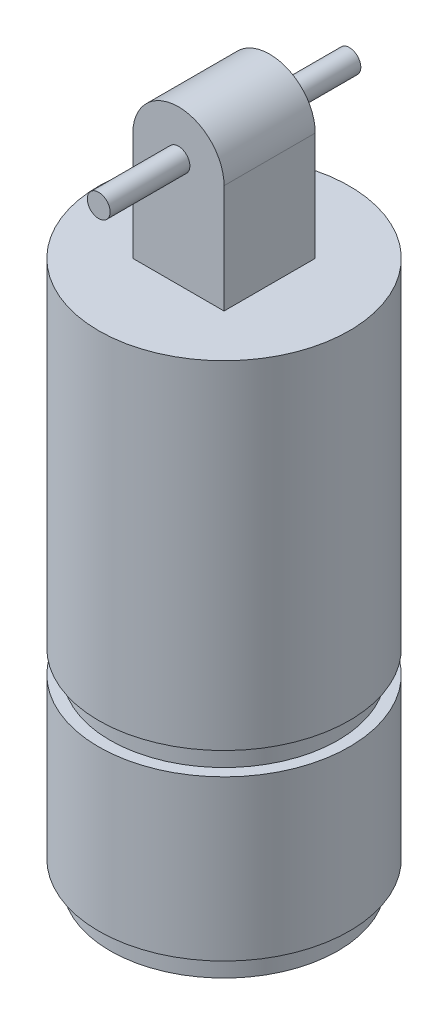
ISO-10303-21;
HEADER;
FILE_DESCRIPTION(('STEP AP214'),'2;1');
FILE_NAME('part.step','',(''),(''),'','','');
FILE_SCHEMA(('AUTOMOTIVE_DESIGN { 1 0 10303 214 1 1 1 1 }'));
ENDSEC;
DATA;
#1=APPLICATION_CONTEXT('core data for automotive mechanical design processes');
#2=APPLICATION_PROTOCOL_DEFINITION('international standard','automotive_design',2000,#1);
#3=PRODUCT_CONTEXT('',#1,'mechanical');
#4=PRODUCT('Part','Part','',(#3));
#5=PRODUCT_RELATED_PRODUCT_CATEGORY('part','',(#4));
#6=PRODUCT_DEFINITION_FORMATION('','',#4);
#7=PRODUCT_DEFINITION_CONTEXT('part definition',#1,'design');
#8=PRODUCT_DEFINITION('design','',#6,#7);
#9=PRODUCT_DEFINITION_SHAPE('','',#8);
#10=(LENGTH_UNIT() NAMED_UNIT(*) SI_UNIT(.MILLI.,.METRE.));
#11=(NAMED_UNIT(*) PLANE_ANGLE_UNIT() SI_UNIT($,.RADIAN.));
#12=(NAMED_UNIT(*) SI_UNIT($,.STERADIAN.) SOLID_ANGLE_UNIT());
#13=UNCERTAINTY_MEASURE_WITH_UNIT(LENGTH_MEASURE(1.E-05),#10,'distance_accuracy_value','');
#14=(GEOMETRIC_REPRESENTATION_CONTEXT(3) GLOBAL_UNCERTAINTY_ASSIGNED_CONTEXT((#13)) GLOBAL_UNIT_ASSIGNED_CONTEXT((#10,
#11,#12)) REPRESENTATION_CONTEXT('',''));
#15=CARTESIAN_POINT('',(0.,0.,0.));
#16=DIRECTION('',(0.,0.,1.));
#17=DIRECTION('',(1.,0.,0.));
#18=AXIS2_PLACEMENT_3D('',#15,#16,#17);
#19=CARTESIAN_POINT('',(0.,23.8125,0.));
#20=DIRECTION('',(0.,1.,0.));
#21=DIRECTION('',(0.,0.,1.));
#22=AXIS2_PLACEMENT_3D('',#19,#20,#21);
#23=PLANE('',#22);
#24=CARTESIAN_POINT('',(0.,23.8125,0.));
#25=DIRECTION('',(0.,1.,0.));
#26=DIRECTION('',(0.,0.,1.));
#27=AXIS2_PLACEMENT_3D('',#24,#25,#26);
#28=CIRCLE('',#27,5.5);
#29=CARTESIAN_POINT('',(0.,23.8125,5.5));
#30=VERTEX_POINT('',#29);
#31=EDGE_CURVE('E116',#30,#30,#28,.T.);
#32=ORIENTED_EDGE('',*,*,#31,.T.);
#33=EDGE_LOOP('',(#32));
#34=FACE_BOUND('',#33,.T.);
#35=DIRECTION('',(0.,0.,-1.));
#36=VECTOR('',#35,1.);
#37=CARTESIAN_POINT('',(-2.,23.8125,2.));
#38=LINE('',#37,#36);
#39=CARTESIAN_POINT('',(-2.,23.8125,2.));
#40=VERTEX_POINT('',#39);
#41=CARTESIAN_POINT('',(-2.,23.8125,-2.));
#42=VERTEX_POINT('',#41);
#43=EDGE_CURVE('E100',#40,#42,#38,.T.);
#44=ORIENTED_EDGE('',*,*,#43,.T.);
#45=DIRECTION('',(1.,0.,0.));
#46=VECTOR('',#45,1.);
#47=CARTESIAN_POINT('',(-2.,23.8125,-2.));
#48=LINE('',#47,#46);
#49=CARTESIAN_POINT('',(2.,23.8125,-2.));
#50=VERTEX_POINT('',#49);
#51=EDGE_CURVE('E99',#42,#50,#48,.T.);
#52=ORIENTED_EDGE('',*,*,#51,.T.);
#53=DIRECTION('',(0.,0.,-1.));
#54=VECTOR('',#53,1.);
#55=CARTESIAN_POINT('',(2.,23.8125,2.));
#56=LINE('',#55,#54);
#57=CARTESIAN_POINT('',(2.,23.8125,2.));
#58=VERTEX_POINT('',#57);
#59=EDGE_CURVE('E94',#58,#50,#56,.T.);
#60=ORIENTED_EDGE('',*,*,#59,.F.);
#61=DIRECTION('',(1.,0.,0.));
#62=VECTOR('',#61,1.);
#63=CARTESIAN_POINT('',(-2.,23.8125,2.));
#64=LINE('',#63,#62);
#65=EDGE_CURVE('E83',#40,#58,#64,.T.);
#66=ORIENTED_EDGE('',*,*,#65,.F.);
#67=EDGE_LOOP('',(#44,#52,#60,#66));
#68=FACE_BOUND('',#67,.T.);
#69=ADVANCED_FACE('F36',(#34,#68),#23,.T.);
#70=CARTESIAN_POINT('',(0.,9.,0.));
#71=DIRECTION('',(0.,-1.,0.));
#72=DIRECTION('',(0.,0.,-1.));
#73=AXIS2_PLACEMENT_3D('',#70,#71,#72);
#74=CYLINDRICAL_SURFACE('',#73,5.);
#75=CARTESIAN_POINT('',(0.,8.,0.));
#76=DIRECTION('',(0.,1.,0.));
#77=DIRECTION('',(0.,0.,1.));
#78=AXIS2_PLACEMENT_3D('',#75,#76,#77);
#79=CIRCLE('',#78,5.);
#80=CARTESIAN_POINT('',(0.,8.,5.));
#81=VERTEX_POINT('',#80);
#82=EDGE_CURVE('E123',#81,#81,#79,.T.);
#83=ORIENTED_EDGE('',*,*,#82,.T.);
#84=EDGE_LOOP('',(#83));
#85=FACE_BOUND('',#84,.T.);
#86=CARTESIAN_POINT('',(0.,9.,0.));
#87=DIRECTION('',(0.,1.,0.));
#88=DIRECTION('',(0.,0.,1.));
#89=AXIS2_PLACEMENT_3D('',#86,#87,#88);
#90=CIRCLE('',#89,5.);
#91=CARTESIAN_POINT('',(0.,9.,5.));
#92=VERTEX_POINT('',#91);
#93=EDGE_CURVE('E126',#92,#92,#90,.T.);
#94=ORIENTED_EDGE('',*,*,#93,.F.);
#95=EDGE_LOOP('',(#94));
#96=FACE_BOUND('',#95,.T.);
#97=ADVANCED_FACE('F38',(#85,#96),#74,.T.);
#98=CARTESIAN_POINT('',(0.,8.,0.));
#99=DIRECTION('',(0.,-1.,0.));
#100=DIRECTION('',(0.,0.,-1.));
#101=AXIS2_PLACEMENT_3D('',#98,#99,#100);
#102=CYLINDRICAL_SURFACE('',#101,5.5);
#103=CARTESIAN_POINT('',(0.,8.,0.));
#104=DIRECTION('',(0.,1.,0.));
#105=DIRECTION('',(0.,0.,1.));
#106=AXIS2_PLACEMENT_3D('',#103,#104,#105);
#107=CIRCLE('',#106,5.5);
#108=CARTESIAN_POINT('',(0.,8.,5.5));
#109=VERTEX_POINT('',#108);
#110=EDGE_CURVE('E120',#109,#109,#107,.T.);
#111=ORIENTED_EDGE('',*,*,#110,.F.);
#112=EDGE_LOOP('',(#111));
#113=FACE_BOUND('',#112,.T.);
#114=CARTESIAN_POINT('',(0.,1.,0.));
#115=DIRECTION('',(0.,1.,0.));
#116=DIRECTION('',(0.,0.,1.));
#117=AXIS2_PLACEMENT_3D('',#114,#115,#116);
#118=CIRCLE('',#117,5.5);
#119=CARTESIAN_POINT('',(0.,1.,5.5));
#120=VERTEX_POINT('',#119);
#121=EDGE_CURVE('E119',#120,#120,#118,.T.);
#122=ORIENTED_EDGE('',*,*,#121,.T.);
#123=EDGE_LOOP('',(#122));
#124=FACE_BOUND('',#123,.T.);
#125=ADVANCED_FACE('F142',(#113,#124),#102,.T.);
#126=CARTESIAN_POINT('',(0.,8.,0.));
#127=DIRECTION('',(0.,1.,0.));
#128=DIRECTION('',(0.,0.,1.));
#129=AXIS2_PLACEMENT_3D('',#126,#127,#128);
#130=PLANE('',#129);
#131=ORIENTED_EDGE('',*,*,#82,.F.);
#132=EDGE_LOOP('',(#131));
#133=FACE_BOUND('',#132,.T.);
#134=ORIENTED_EDGE('',*,*,#110,.T.);
#135=EDGE_LOOP('',(#134));
#136=FACE_BOUND('',#135,.T.);
#137=ADVANCED_FACE('F138',(#133,#136),#130,.T.);
#138=CARTESIAN_POINT('',(0.,1.,0.));
#139=DIRECTION('',(0.,1.,0.));
#140=DIRECTION('',(0.,0.,1.));
#141=AXIS2_PLACEMENT_3D('',#138,#139,#140);
#142=PLANE('',#141);
#143=CARTESIAN_POINT('',(0.,0.999999999999999,0.));
#144=DIRECTION('',(0.,1.,0.));
#145=DIRECTION('',(0.,0.,1.));
#146=AXIS2_PLACEMENT_3D('',#143,#144,#145);
#147=CIRCLE('',#146,5.);
#148=CARTESIAN_POINT('',(0.,0.999999999999999,5.));
#149=VERTEX_POINT('',#148);
#150=EDGE_CURVE('E44',#149,#149,#147,.T.);
#151=ORIENTED_EDGE('',*,*,#150,.T.);
#152=EDGE_LOOP('',(#151));
#153=FACE_BOUND('',#152,.T.);
#154=ORIENTED_EDGE('',*,*,#121,.F.);
#155=EDGE_LOOP('',(#154));
#156=FACE_BOUND('',#155,.T.);
#157=ADVANCED_FACE('F141',(#153,#156),#142,.F.);
#158=CARTESIAN_POINT('',(0.,0.,0.));
#159=DIRECTION('',(0.,1.,0.));
#160=DIRECTION('',(0.,0.,1.));
#161=AXIS2_PLACEMENT_3D('',#158,#159,#160);
#162=PLANE('',#161);
#163=CARTESIAN_POINT('',(0.,0.,0.));
#164=DIRECTION('',(0.,-1.,0.));
#165=DIRECTION('',(0.,0.,-1.));
#166=AXIS2_PLACEMENT_3D('',#163,#164,#165);
#167=CIRCLE('',#166,4.);
#168=CARTESIAN_POINT('',(0.,0.,-4.));
#169=VERTEX_POINT('',#168);
#170=EDGE_CURVE('E102',#169,#169,#167,.T.);
#171=ORIENTED_EDGE('',*,*,#170,.F.);
#172=EDGE_LOOP('',(#171));
#173=FACE_BOUND('',#172,.T.);
#174=CARTESIAN_POINT('',(0.,0.,0.));
#175=DIRECTION('',(0.,1.,0.));
#176=DIRECTION('',(0.,0.,1.));
#177=AXIS2_PLACEMENT_3D('',#174,#175,#176);
#178=CIRCLE('',#177,5.);
#179=CARTESIAN_POINT('',(0.,0.,5.));
#180=VERTEX_POINT('',#179);
#181=EDGE_CURVE('E129',#180,#180,#178,.T.);
#182=ORIENTED_EDGE('',*,*,#181,.F.);
#183=EDGE_LOOP('',(#182));
#184=FACE_BOUND('',#183,.T.);
#185=ADVANCED_FACE('F152',(#173,#184),#162,.F.);
#186=ORIENTED_EDGE('',*,*,#181,.T.);
#187=EDGE_LOOP('',(#186));
#188=FACE_BOUND('',#187,.T.);
#189=ORIENTED_EDGE('',*,*,#150,.F.);
#190=EDGE_LOOP('',(#189));
#191=FACE_BOUND('',#190,.T.);
#192=ADVANCED_FACE('F158',(#188,#191),#74,.T.);
#193=CARTESIAN_POINT('',(0.,39.368849186104,0.));
#194=DIRECTION('',(0.,-1.,0.));
#195=DIRECTION('',(0.,0.,-1.));
#196=AXIS2_PLACEMENT_3D('',#193,#194,#195);
#197=CYLINDRICAL_SURFACE('',#196,5.5);
#198=CARTESIAN_POINT('',(0.,9.,0.));
#199=DIRECTION('',(0.,1.,0.));
#200=DIRECTION('',(0.,0.,1.));
#201=AXIS2_PLACEMENT_3D('',#198,#199,#200);
#202=CIRCLE('',#201,5.5);
#203=CARTESIAN_POINT('',(0.,9.,5.5));
#204=VERTEX_POINT('',#203);
#205=EDGE_CURVE('E111',#204,#204,#202,.T.);
#206=ORIENTED_EDGE('',*,*,#205,.T.);
#207=EDGE_LOOP('',(#206));
#208=FACE_BOUND('',#207,.T.);
#209=ORIENTED_EDGE('',*,*,#31,.F.);
#210=EDGE_LOOP('',(#209));
#211=FACE_BOUND('',#210,.T.);
#212=ADVANCED_FACE('F167',(#208,#211),#197,.T.);
#213=CARTESIAN_POINT('',(0.,9.,0.));
#214=DIRECTION('',(0.,1.,0.));
#215=DIRECTION('',(0.,0.,1.));
#216=AXIS2_PLACEMENT_3D('',#213,#214,#215);
#217=PLANE('',#216);
#218=ORIENTED_EDGE('',*,*,#93,.T.);
#219=EDGE_LOOP('',(#218));
#220=FACE_BOUND('',#219,.T.);
#221=ORIENTED_EDGE('',*,*,#205,.F.);
#222=EDGE_LOOP('',(#221));
#223=FACE_BOUND('',#222,.T.);
#224=ADVANCED_FACE('F170',(#220,#223),#217,.F.);
#225=CARTESIAN_POINT('',(0.,7.,0.));
#226=DIRECTION('',(0.,-1.,0.));
#227=DIRECTION('',(0.,0.,-1.));
#228=AXIS2_PLACEMENT_3D('',#225,#226,#227);
#229=CYLINDRICAL_SURFACE('',#228,4.);
#230=CARTESIAN_POINT('',(0.,7.,0.));
#231=DIRECTION('',(0.,-1.,0.));
#232=DIRECTION('',(0.,0.,-1.));
#233=AXIS2_PLACEMENT_3D('',#230,#231,#232);
#234=CIRCLE('',#233,4.);
#235=CARTESIAN_POINT('',(0.,7.,-4.));
#236=VERTEX_POINT('',#235);
#237=EDGE_CURVE('E108',#236,#236,#234,.T.);
#238=ORIENTED_EDGE('',*,*,#237,.F.);
#239=EDGE_LOOP('',(#238));
#240=FACE_BOUND('',#239,.T.);
#241=ORIENTED_EDGE('',*,*,#170,.T.);
#242=EDGE_LOOP('',(#241));
#243=FACE_BOUND('',#242,.T.);
#244=ADVANCED_FACE('F174',(#240,#243),#229,.F.);
#245=CARTESIAN_POINT('',(0.,7.,0.));
#246=DIRECTION('',(0.,-1.,0.));
#247=DIRECTION('',(0.,0.,-1.));
#248=AXIS2_PLACEMENT_3D('',#245,#246,#247);
#249=PLANE('',#248);
#250=ORIENTED_EDGE('',*,*,#237,.T.);
#251=EDGE_LOOP('',(#250));
#252=FACE_BOUND('',#251,.T.);
#253=ADVANCED_FACE('F178',(#252),#249,.T.);
#254=CARTESIAN_POINT('',(-2.,28.575,2.));
#255=DIRECTION('',(1.,0.,0.));
#256=DIRECTION('',(0.,1.,0.));
#257=AXIS2_PLACEMENT_3D('',#254,#255,#256);
#258=PLANE('',#257);
#259=DIRECTION('',(0.,-1.,0.));
#260=VECTOR('',#259,1.);
#261=CARTESIAN_POINT('',(-2.,28.575,-2.));
#262=LINE('',#261,#260);
#263=CARTESIAN_POINT('',(-2.,28.575,-2.));
#264=VERTEX_POINT('',#263);
#265=EDGE_CURVE('E51',#264,#42,#262,.T.);
#266=ORIENTED_EDGE('',*,*,#265,.T.);
#267=ORIENTED_EDGE('',*,*,#43,.F.);
#268=DIRECTION('',(0.,-1.,0.));
#269=VECTOR('',#268,1.);
#270=CARTESIAN_POINT('',(-2.,28.575,2.));
#271=LINE('',#270,#269);
#272=CARTESIAN_POINT('',(-2.,28.575,2.));
#273=VERTEX_POINT('',#272);
#274=EDGE_CURVE('E81',#273,#40,#271,.T.);
#275=ORIENTED_EDGE('',*,*,#274,.F.);
#276=DIRECTION('',(0.,0.,-1.));
#277=VECTOR('',#276,1.);
#278=CARTESIAN_POINT('',(-2.,28.575,2.));
#279=LINE('',#278,#277);
#280=EDGE_CURVE('E104',#273,#264,#279,.T.);
#281=ORIENTED_EDGE('',*,*,#280,.T.);
#282=EDGE_LOOP('',(#266,#267,#275,#281));
#283=FACE_BOUND('',#282,.T.);
#284=ADVANCED_FACE('F182',(#283),#258,.F.);
#285=CARTESIAN_POINT('',(2.,23.8125,2.));
#286=DIRECTION('',(-1.,0.,0.));
#287=DIRECTION('',(0.,-1.,0.));
#288=AXIS2_PLACEMENT_3D('',#285,#286,#287);
#289=PLANE('',#288);
#290=DIRECTION('',(0.,1.,0.));
#291=VECTOR('',#290,1.);
#292=CARTESIAN_POINT('',(2.,23.8125,-2.));
#293=LINE('',#292,#291);
#294=CARTESIAN_POINT('',(2.,28.575,-2.));
#295=VERTEX_POINT('',#294);
#296=EDGE_CURVE('E229',#50,#295,#293,.T.);
#297=ORIENTED_EDGE('',*,*,#296,.T.);
#298=DIRECTION('',(0.,0.,-1.));
#299=VECTOR('',#298,1.);
#300=CARTESIAN_POINT('',(2.,28.575,2.));
#301=LINE('',#300,#299);
#302=CARTESIAN_POINT('',(2.,28.575,2.));
#303=VERTEX_POINT('',#302);
#304=EDGE_CURVE('E96',#303,#295,#301,.T.);
#305=ORIENTED_EDGE('',*,*,#304,.F.);
#306=DIRECTION('',(0.,1.,0.));
#307=VECTOR('',#306,1.);
#308=CARTESIAN_POINT('',(2.,23.8125,2.));
#309=LINE('',#308,#307);
#310=EDGE_CURVE('E86',#58,#303,#309,.T.);
#311=ORIENTED_EDGE('',*,*,#310,.F.);
#312=ORIENTED_EDGE('',*,*,#59,.T.);
#313=EDGE_LOOP('',(#297,#305,#311,#312));
#314=FACE_BOUND('',#313,.T.);
#315=ADVANCED_FACE('F93',(#314),#289,.F.);
#316=CARTESIAN_POINT('',(0.,28.575,2.));
#317=DIRECTION('',(0.,0.,-1.));
#318=DIRECTION('',(-1.,0.,0.));
#319=AXIS2_PLACEMENT_3D('',#316,#317,#318);
#320=CYLINDRICAL_SURFACE('',#319,2.);
#321=CARTESIAN_POINT('',(0.,28.575,-2.));
#322=DIRECTION('',(0.,0.,1.));
#323=DIRECTION('',(1.,0.,0.));
#324=AXIS2_PLACEMENT_3D('',#321,#322,#323);
#325=CIRCLE('',#324,2.);
#326=EDGE_CURVE('E77',#295,#264,#325,.T.);
#327=ORIENTED_EDGE('',*,*,#326,.T.);
#328=ORIENTED_EDGE('',*,*,#280,.F.);
#329=CARTESIAN_POINT('',(0.,28.575,2.));
#330=DIRECTION('',(0.,0.,1.));
#331=DIRECTION('',(1.,0.,0.));
#332=AXIS2_PLACEMENT_3D('',#329,#330,#331);
#333=CIRCLE('',#332,2.);
#334=EDGE_CURVE('E60',#303,#273,#333,.T.);
#335=ORIENTED_EDGE('',*,*,#334,.F.);
#336=ORIENTED_EDGE('',*,*,#304,.T.);
#337=EDGE_LOOP('',(#327,#328,#335,#336));
#338=FACE_BOUND('',#337,.T.);
#339=ADVANCED_FACE('F188',(#338),#320,.T.);
#340=CARTESIAN_POINT('',(0.,28.575,2.));
#341=DIRECTION('',(0.,0.,1.));
#342=DIRECTION('',(1.,0.,0.));
#343=AXIS2_PLACEMENT_3D('',#340,#341,#342);
#344=PLANE('',#343);
#345=CARTESIAN_POINT('',(0.,28.575,2.));
#346=DIRECTION('',(0.,0.,1.));
#347=DIRECTION('',(1.,0.,0.));
#348=AXIS2_PLACEMENT_3D('',#345,#346,#347);
#349=CIRCLE('',#348,0.5);
#350=CARTESIAN_POINT('',(0.5,28.575,2.));
#351=VERTEX_POINT('',#350);
#352=EDGE_CURVE('E220',#351,#351,#349,.F.);
#353=ORIENTED_EDGE('',*,*,#352,.T.);
#354=EDGE_LOOP('',(#353));
#355=FACE_BOUND('',#354,.T.);
#356=ORIENTED_EDGE('',*,*,#274,.T.);
#357=ORIENTED_EDGE('',*,*,#65,.T.);
#358=ORIENTED_EDGE('',*,*,#310,.T.);
#359=ORIENTED_EDGE('',*,*,#334,.T.);
#360=EDGE_LOOP('',(#356,#357,#358,#359));
#361=FACE_BOUND('',#360,.T.);
#362=ADVANCED_FACE('F85',(#355,#361),#344,.T.);
#363=CARTESIAN_POINT('',(0.,28.575,-2.));
#364=DIRECTION('',(0.,0.,1.));
#365=DIRECTION('',(1.,0.,0.));
#366=AXIS2_PLACEMENT_3D('',#363,#364,#365);
#367=PLANE('',#366);
#368=CARTESIAN_POINT('',(0.,28.575,-2.));
#369=DIRECTION('',(0.,0.,1.));
#370=DIRECTION('',(1.,0.,0.));
#371=AXIS2_PLACEMENT_3D('',#368,#369,#370);
#372=CIRCLE('',#371,0.5);
#373=CARTESIAN_POINT('',(0.5,28.575,-2.));
#374=VERTEX_POINT('',#373);
#375=EDGE_CURVE('E11',#374,#374,#372,.F.);
#376=ORIENTED_EDGE('',*,*,#375,.F.);
#377=EDGE_LOOP('',(#376));
#378=FACE_BOUND('',#377,.T.);
#379=ORIENTED_EDGE('',*,*,#265,.F.);
#380=ORIENTED_EDGE('',*,*,#326,.F.);
#381=ORIENTED_EDGE('',*,*,#296,.F.);
#382=ORIENTED_EDGE('',*,*,#51,.F.);
#383=EDGE_LOOP('',(#379,#380,#381,#382));
#384=FACE_BOUND('',#383,.T.);
#385=ADVANCED_FACE('F191',(#378,#384),#367,.F.);
#386=CARTESIAN_POINT('',(0.,28.575,-5.5));
#387=DIRECTION('',(0.,0.,1.));
#388=DIRECTION('',(1.,0.,0.));
#389=AXIS2_PLACEMENT_3D('',#386,#387,#388);
#390=PLANE('',#389);
#391=CARTESIAN_POINT('',(0.,28.575,-5.5));
#392=DIRECTION('',(0.,0.,1.));
#393=DIRECTION('',(1.,0.,0.));
#394=AXIS2_PLACEMENT_3D('',#391,#392,#393);
#395=CIRCLE('',#394,0.5);
#396=CARTESIAN_POINT('',(0.5,28.575,-5.5));
#397=VERTEX_POINT('',#396);
#398=EDGE_CURVE('E216',#397,#397,#395,.T.);
#399=ORIENTED_EDGE('',*,*,#398,.F.);
#400=EDGE_LOOP('',(#399));
#401=FACE_BOUND('',#400,.T.);
#402=ADVANCED_FACE('F194',(#401),#390,.F.);
#403=CARTESIAN_POINT('',(0.,28.575,5.5));
#404=DIRECTION('',(0.,0.,-1.));
#405=DIRECTION('',(-1.,0.,0.));
#406=AXIS2_PLACEMENT_3D('',#403,#404,#405);
#407=CYLINDRICAL_SURFACE('',#406,0.5);
#408=ORIENTED_EDGE('',*,*,#398,.T.);
#409=EDGE_LOOP('',(#408));
#410=FACE_BOUND('',#409,.T.);
#411=ORIENTED_EDGE('',*,*,#375,.T.);
#412=EDGE_LOOP('',(#411));
#413=FACE_BOUND('',#412,.T.);
#414=ADVANCED_FACE('F203',(#410,#413),#407,.T.);
#415=ORIENTED_EDGE('',*,*,#352,.F.);
#416=EDGE_LOOP('',(#415));
#417=FACE_BOUND('',#416,.T.);
#418=CARTESIAN_POINT('',(0.,28.575,5.5));
#419=DIRECTION('',(0.,0.,1.));
#420=DIRECTION('',(1.,0.,0.));
#421=AXIS2_PLACEMENT_3D('',#418,#419,#420);
#422=CIRCLE('',#421,0.5);
#423=CARTESIAN_POINT('',(0.5,28.575,5.5));
#424=VERTEX_POINT('',#423);
#425=EDGE_CURVE('E217',#424,#424,#422,.T.);
#426=ORIENTED_EDGE('',*,*,#425,.F.);
#427=EDGE_LOOP('',(#426));
#428=FACE_BOUND('',#427,.T.);
#429=ADVANCED_FACE('F199',(#417,#428),#407,.T.);
#430=CARTESIAN_POINT('',(0.,28.575,5.5));
#431=DIRECTION('',(0.,0.,1.));
#432=DIRECTION('',(1.,0.,0.));
#433=AXIS2_PLACEMENT_3D('',#430,#431,#432);
#434=PLANE('',#433);
#435=ORIENTED_EDGE('',*,*,#425,.T.);
#436=EDGE_LOOP('',(#435));
#437=FACE_BOUND('',#436,.T.);
#438=ADVANCED_FACE('F202',(#437),#434,.T.);
#439=CLOSED_SHELL('',(#69,#97,#125,#137,#157,#185,#192,#212,#224,#244,#253,#284,#315,#339,#362,
#385,#402,#414,#429,#438));
#440=MANIFOLD_SOLID_BREP('B2',#439);
#441=ADVANCED_BREP_SHAPE_REPRESENTATION('',(#18,#440),#14);
#442=SHAPE_DEFINITION_REPRESENTATION(#9,#441);
ENDSEC;
END-ISO-10303-21;
